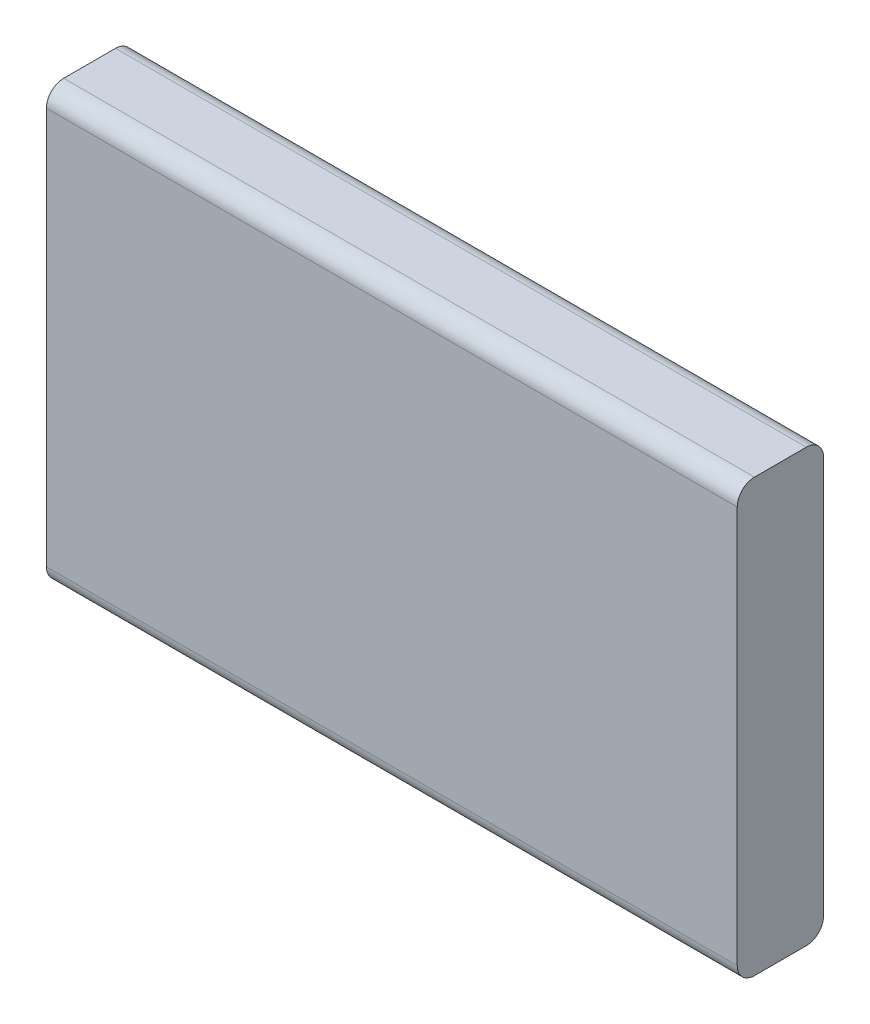
ISO-10303-21;
HEADER;
FILE_DESCRIPTION(('STEP AP214'),'2;1');
FILE_NAME('part.step','',(''),(''),'','','');
FILE_SCHEMA(('AUTOMOTIVE_DESIGN { 1 0 10303 214 1 1 1 1 }'));
ENDSEC;
DATA;
#1=APPLICATION_CONTEXT('core data for automotive mechanical design processes');
#2=APPLICATION_PROTOCOL_DEFINITION('international standard','automotive_design',2000,#1);
#3=PRODUCT_CONTEXT('',#1,'mechanical');
#4=PRODUCT('Part','Part','',(#3));
#5=PRODUCT_RELATED_PRODUCT_CATEGORY('part','',(#4));
#6=PRODUCT_DEFINITION_FORMATION('','',#4);
#7=PRODUCT_DEFINITION_CONTEXT('part definition',#1,'design');
#8=PRODUCT_DEFINITION('design','',#6,#7);
#9=PRODUCT_DEFINITION_SHAPE('','',#8);
#10=(LENGTH_UNIT() NAMED_UNIT(*) SI_UNIT(.MILLI.,.METRE.));
#11=(NAMED_UNIT(*) PLANE_ANGLE_UNIT() SI_UNIT($,.RADIAN.));
#12=(NAMED_UNIT(*) SI_UNIT($,.STERADIAN.) SOLID_ANGLE_UNIT());
#13=UNCERTAINTY_MEASURE_WITH_UNIT(LENGTH_MEASURE(1.E-05),#10,'distance_accuracy_value','');
#14=(GEOMETRIC_REPRESENTATION_CONTEXT(3) GLOBAL_UNCERTAINTY_ASSIGNED_CONTEXT((#13)) GLOBAL_UNIT_ASSIGNED_CONTEXT((#10,
#11,#12)) REPRESENTATION_CONTEXT('',''));
#15=CARTESIAN_POINT('',(0.,0.,0.));
#16=DIRECTION('',(0.,0.,1.));
#17=DIRECTION('',(1.,0.,0.));
#18=AXIS2_PLACEMENT_3D('',#15,#16,#17);
#19=CARTESIAN_POINT('',(-20.,12.5,-5.));
#20=DIRECTION('',(-1.,0.,0.));
#21=DIRECTION('',(0.,0.,1.));
#22=AXIS2_PLACEMENT_3D('',#19,#20,#21);
#23=PLANE('',#22);
#24=DIRECTION('',(0.,0.,1.));
#25=VECTOR('',#24,1.);
#26=CARTESIAN_POINT('',(-20.,12.5,-5.));
#27=LINE('',#26,#25);
#28=CARTESIAN_POINT('',(-20.,12.5,-4.));
#29=VERTEX_POINT('',#28);
#30=CARTESIAN_POINT('',(-20.,12.5,-1.));
#31=VERTEX_POINT('',#30);
#32=EDGE_CURVE('E119',#29,#31,#27,.T.);
#33=ORIENTED_EDGE('',*,*,#32,.F.);
#34=CARTESIAN_POINT('',(-20.,11.5,-4.));
#35=DIRECTION('',(-1.,0.,0.));
#36=DIRECTION('',(0.,0.,1.));
#37=AXIS2_PLACEMENT_3D('',#34,#35,#36);
#38=CIRCLE('',#37,1.);
#39=CARTESIAN_POINT('',(-20.,11.5,-5.));
#40=VERTEX_POINT('',#39);
#41=EDGE_CURVE('E147',#29,#40,#38,.T.);
#42=ORIENTED_EDGE('',*,*,#41,.T.);
#43=DIRECTION('',(0.,-1.,0.));
#44=VECTOR('',#43,1.);
#45=CARTESIAN_POINT('',(-20.,12.5,-5.));
#46=LINE('',#45,#44);
#47=CARTESIAN_POINT('',(-20.,-11.5,-5.));
#48=VERTEX_POINT('',#47);
#49=EDGE_CURVE('E125',#40,#48,#46,.T.);
#50=ORIENTED_EDGE('',*,*,#49,.T.);
#51=CARTESIAN_POINT('',(-20.,-11.5,-4.));
#52=DIRECTION('',(-1.,0.,0.));
#53=DIRECTION('',(0.,0.,1.));
#54=AXIS2_PLACEMENT_3D('',#51,#52,#53);
#55=CIRCLE('',#54,1.);
#56=CARTESIAN_POINT('',(-20.,-12.5,-4.));
#57=VERTEX_POINT('',#56);
#58=EDGE_CURVE('E144',#48,#57,#55,.T.);
#59=ORIENTED_EDGE('',*,*,#58,.T.);
#60=DIRECTION('',(0.,0.,1.));
#61=VECTOR('',#60,1.);
#62=CARTESIAN_POINT('',(-20.,-12.5,-5.));
#63=LINE('',#62,#61);
#64=CARTESIAN_POINT('',(-20.,-12.5,-1.));
#65=VERTEX_POINT('',#64);
#66=EDGE_CURVE('E136',#57,#65,#63,.T.);
#67=ORIENTED_EDGE('',*,*,#66,.T.);
#68=CARTESIAN_POINT('',(-20.,-11.5,-1.));
#69=DIRECTION('',(-1.,0.,0.));
#70=DIRECTION('',(0.,0.,1.));
#71=AXIS2_PLACEMENT_3D('',#68,#69,#70);
#72=CIRCLE('',#71,1.);
#73=CARTESIAN_POINT('',(-20.,-11.5,0.));
#74=VERTEX_POINT('',#73);
#75=EDGE_CURVE('E123',#65,#74,#72,.T.);
#76=ORIENTED_EDGE('',*,*,#75,.T.);
#77=DIRECTION('',(0.,-1.,0.));
#78=VECTOR('',#77,1.);
#79=CARTESIAN_POINT('',(-20.,12.5,0.));
#80=LINE('',#79,#78);
#81=CARTESIAN_POINT('',(-20.,11.5,0.));
#82=VERTEX_POINT('',#81);
#83=EDGE_CURVE('E115',#82,#74,#80,.T.);
#84=ORIENTED_EDGE('',*,*,#83,.F.);
#85=CARTESIAN_POINT('',(-20.,11.5,-1.));
#86=DIRECTION('',(-1.,0.,0.));
#87=DIRECTION('',(0.,0.,1.));
#88=AXIS2_PLACEMENT_3D('',#85,#86,#87);
#89=CIRCLE('',#88,1.);
#90=EDGE_CURVE('E100',#82,#31,#89,.T.);
#91=ORIENTED_EDGE('',*,*,#90,.T.);
#92=EDGE_LOOP('',(#33,#42,#50,#59,#67,#76,#84,#91));
#93=FACE_BOUND('',#92,.T.);
#94=ADVANCED_FACE('F33',(#93),#23,.T.);
#95=CARTESIAN_POINT('',(-20.,12.5,-5.));
#96=DIRECTION('',(0.,1.,0.));
#97=DIRECTION('',(-1.,0.,0.));
#98=AXIS2_PLACEMENT_3D('',#95,#96,#97);
#99=PLANE('',#98);
#100=DIRECTION('',(0.,0.,1.));
#101=VECTOR('',#100,1.);
#102=CARTESIAN_POINT('',(20.,12.5,-5.));
#103=LINE('',#102,#101);
#104=CARTESIAN_POINT('',(20.,12.5,-4.));
#105=VERTEX_POINT('',#104);
#106=CARTESIAN_POINT('',(20.,12.5,-1.));
#107=VERTEX_POINT('',#106);
#108=EDGE_CURVE('E132',#105,#107,#103,.T.);
#109=ORIENTED_EDGE('',*,*,#108,.F.);
#110=DIRECTION('',(-1.,0.,0.));
#111=VECTOR('',#110,1.);
#112=CARTESIAN_POINT('',(-20.,12.5,-4.));
#113=LINE('',#112,#111);
#114=EDGE_CURVE('E141',#105,#29,#113,.T.);
#115=ORIENTED_EDGE('',*,*,#114,.T.);
#116=ORIENTED_EDGE('',*,*,#32,.T.);
#117=DIRECTION('',(-1.,0.,0.));
#118=VECTOR('',#117,1.);
#119=CARTESIAN_POINT('',(-20.,12.5,-1.));
#120=LINE('',#119,#118);
#121=EDGE_CURVE('E106',#31,#107,#120,.F.);
#122=ORIENTED_EDGE('',*,*,#121,.T.);
#123=EDGE_LOOP('',(#109,#115,#116,#122));
#124=FACE_BOUND('',#123,.T.);
#125=ADVANCED_FACE('F177',(#124),#99,.T.);
#126=CARTESIAN_POINT('',(20.,12.5,-5.));
#127=DIRECTION('',(1.,0.,0.));
#128=DIRECTION('',(0.,0.,-1.));
#129=AXIS2_PLACEMENT_3D('',#126,#127,#128);
#130=PLANE('',#129);
#131=DIRECTION('',(0.,1.,0.));
#132=VECTOR('',#131,1.);
#133=CARTESIAN_POINT('',(20.,12.5,-5.));
#134=LINE('',#133,#132);
#135=CARTESIAN_POINT('',(20.,-11.5,-5.));
#136=VERTEX_POINT('',#135);
#137=CARTESIAN_POINT('',(20.,11.5,-5.));
#138=VERTEX_POINT('',#137);
#139=EDGE_CURVE('E128',#136,#138,#134,.T.);
#140=ORIENTED_EDGE('',*,*,#139,.T.);
#141=CARTESIAN_POINT('',(20.,11.5,-4.));
#142=DIRECTION('',(1.,0.,0.));
#143=DIRECTION('',(0.,0.,-1.));
#144=AXIS2_PLACEMENT_3D('',#141,#142,#143);
#145=CIRCLE('',#144,1.);
#146=EDGE_CURVE('E155',#138,#105,#145,.T.);
#147=ORIENTED_EDGE('',*,*,#146,.T.);
#148=ORIENTED_EDGE('',*,*,#108,.T.);
#149=CARTESIAN_POINT('',(20.,11.5,-1.));
#150=DIRECTION('',(1.,0.,0.));
#151=DIRECTION('',(0.,0.,-1.));
#152=AXIS2_PLACEMENT_3D('',#149,#150,#151);
#153=CIRCLE('',#152,1.);
#154=CARTESIAN_POINT('',(20.,11.5,0.));
#155=VERTEX_POINT('',#154);
#156=EDGE_CURVE('E139',#107,#155,#153,.T.);
#157=ORIENTED_EDGE('',*,*,#156,.T.);
#158=DIRECTION('',(0.,1.,0.));
#159=VECTOR('',#158,1.);
#160=CARTESIAN_POINT('',(20.,12.5,0.));
#161=LINE('',#160,#159);
#162=CARTESIAN_POINT('',(20.,-11.5,0.));
#163=VERTEX_POINT('',#162);
#164=EDGE_CURVE('E117',#163,#155,#161,.T.);
#165=ORIENTED_EDGE('',*,*,#164,.F.);
#166=CARTESIAN_POINT('',(20.,-11.5,-1.));
#167=DIRECTION('',(1.,0.,0.));
#168=DIRECTION('',(0.,0.,-1.));
#169=AXIS2_PLACEMENT_3D('',#166,#167,#168);
#170=CIRCLE('',#169,1.);
#171=CARTESIAN_POINT('',(20.,-12.5,-1.));
#172=VERTEX_POINT('',#171);
#173=EDGE_CURVE('E48',#163,#172,#170,.T.);
#174=ORIENTED_EDGE('',*,*,#173,.T.);
#175=DIRECTION('',(0.,0.,1.));
#176=VECTOR('',#175,1.);
#177=CARTESIAN_POINT('',(20.,-12.5,-5.));
#178=LINE('',#177,#176);
#179=CARTESIAN_POINT('',(20.,-12.5,-4.));
#180=VERTEX_POINT('',#179);
#181=EDGE_CURVE('E134',#180,#172,#178,.T.);
#182=ORIENTED_EDGE('',*,*,#181,.F.);
#183=CARTESIAN_POINT('',(20.,-11.5,-4.));
#184=DIRECTION('',(1.,0.,0.));
#185=DIRECTION('',(0.,0.,-1.));
#186=AXIS2_PLACEMENT_3D('',#183,#184,#185);
#187=CIRCLE('',#186,1.);
#188=EDGE_CURVE('E56',#180,#136,#187,.T.);
#189=ORIENTED_EDGE('',*,*,#188,.T.);
#190=EDGE_LOOP('',(#140,#147,#148,#157,#165,#174,#182,#189));
#191=FACE_BOUND('',#190,.T.);
#192=ADVANCED_FACE('F164',(#191),#130,.T.);
#193=CARTESIAN_POINT('',(-20.,-12.5,-5.));
#194=DIRECTION('',(0.,-1.,0.));
#195=DIRECTION('',(1.,0.,0.));
#196=AXIS2_PLACEMENT_3D('',#193,#194,#195);
#197=PLANE('',#196);
#198=ORIENTED_EDGE('',*,*,#181,.T.);
#199=DIRECTION('',(1.,0.,0.));
#200=VECTOR('',#199,1.);
#201=CARTESIAN_POINT('',(-20.,-12.5,-1.));
#202=LINE('',#201,#200);
#203=EDGE_CURVE('E11',#172,#65,#202,.F.);
#204=ORIENTED_EDGE('',*,*,#203,.T.);
#205=ORIENTED_EDGE('',*,*,#66,.F.);
#206=DIRECTION('',(1.,0.,0.));
#207=VECTOR('',#206,1.);
#208=CARTESIAN_POINT('',(20.,-12.5,-4.));
#209=LINE('',#208,#207);
#210=EDGE_CURVE('E41',#57,#180,#209,.T.);
#211=ORIENTED_EDGE('',*,*,#210,.T.);
#212=EDGE_LOOP('',(#198,#204,#205,#211));
#213=FACE_BOUND('',#212,.T.);
#214=ADVANCED_FACE('F160',(#213),#197,.T.);
#215=CARTESIAN_POINT('',(0.,0.,-5.));
#216=DIRECTION('',(0.,0.,1.));
#217=DIRECTION('',(1.,0.,0.));
#218=AXIS2_PLACEMENT_3D('',#215,#216,#217);
#219=PLANE('',#218);
#220=ORIENTED_EDGE('',*,*,#49,.F.);
#221=DIRECTION('',(-1.,0.,0.));
#222=VECTOR('',#221,1.);
#223=CARTESIAN_POINT('',(20.,11.5,-5.));
#224=LINE('',#223,#222);
#225=EDGE_CURVE('E151',#40,#138,#224,.F.);
#226=ORIENTED_EDGE('',*,*,#225,.T.);
#227=ORIENTED_EDGE('',*,*,#139,.F.);
#228=DIRECTION('',(1.,0.,0.));
#229=VECTOR('',#228,1.);
#230=CARTESIAN_POINT('',(-20.,-11.5,-5.));
#231=LINE('',#230,#229);
#232=EDGE_CURVE('E149',#136,#48,#231,.F.);
#233=ORIENTED_EDGE('',*,*,#232,.T.);
#234=EDGE_LOOP('',(#220,#226,#227,#233));
#235=FACE_BOUND('',#234,.T.);
#236=ADVANCED_FACE('F169',(#235),#219,.F.);
#237=CARTESIAN_POINT('',(0.,0.,0.));
#238=DIRECTION('',(0.,0.,1.));
#239=DIRECTION('',(1.,0.,0.));
#240=AXIS2_PLACEMENT_3D('',#237,#238,#239);
#241=PLANE('',#240);
#242=ORIENTED_EDGE('',*,*,#83,.T.);
#243=DIRECTION('',(1.,0.,0.));
#244=VECTOR('',#243,1.);
#245=CARTESIAN_POINT('',(0.,-11.5,0.));
#246=LINE('',#245,#244);
#247=EDGE_CURVE('E157',#74,#163,#246,.T.);
#248=ORIENTED_EDGE('',*,*,#247,.T.);
#249=ORIENTED_EDGE('',*,*,#164,.T.);
#250=DIRECTION('',(-1.,0.,0.));
#251=VECTOR('',#250,1.);
#252=CARTESIAN_POINT('',(0.,11.5,0.));
#253=LINE('',#252,#251);
#254=EDGE_CURVE('E104',#155,#82,#253,.T.);
#255=ORIENTED_EDGE('',*,*,#254,.T.);
#256=EDGE_LOOP('',(#242,#248,#249,#255));
#257=FACE_BOUND('',#256,.T.);
#258=ADVANCED_FACE('F113',(#257),#241,.T.);
#259=CARTESIAN_POINT('',(0.,11.5,-1.));
#260=DIRECTION('',(-1.,0.,0.));
#261=DIRECTION('',(0.,-1.,0.));
#262=AXIS2_PLACEMENT_3D('',#259,#260,#261);
#263=CYLINDRICAL_SURFACE('',#262,1.);
#264=ORIENTED_EDGE('',*,*,#156,.F.);
#265=ORIENTED_EDGE('',*,*,#121,.F.);
#266=ORIENTED_EDGE('',*,*,#90,.F.);
#267=ORIENTED_EDGE('',*,*,#254,.F.);
#268=EDGE_LOOP('',(#264,#265,#266,#267));
#269=FACE_BOUND('',#268,.T.);
#270=ADVANCED_FACE('F103',(#269),#263,.T.);
#271=CARTESIAN_POINT('',(-20.,11.5,-4.));
#272=DIRECTION('',(1.,0.,0.));
#273=DIRECTION('',(0.,1.,0.));
#274=AXIS2_PLACEMENT_3D('',#271,#272,#273);
#275=CYLINDRICAL_SURFACE('',#274,1.);
#276=ORIENTED_EDGE('',*,*,#146,.F.);
#277=ORIENTED_EDGE('',*,*,#225,.F.);
#278=ORIENTED_EDGE('',*,*,#41,.F.);
#279=ORIENTED_EDGE('',*,*,#114,.F.);
#280=EDGE_LOOP('',(#276,#277,#278,#279));
#281=FACE_BOUND('',#280,.T.);
#282=ADVANCED_FACE('F173',(#281),#275,.T.);
#283=CARTESIAN_POINT('',(0.,-11.5,-1.));
#284=DIRECTION('',(1.,0.,0.));
#285=DIRECTION('',(0.,1.,0.));
#286=AXIS2_PLACEMENT_3D('',#283,#284,#285);
#287=CYLINDRICAL_SURFACE('',#286,1.);
#288=ORIENTED_EDGE('',*,*,#75,.F.);
#289=ORIENTED_EDGE('',*,*,#203,.F.);
#290=ORIENTED_EDGE('',*,*,#173,.F.);
#291=ORIENTED_EDGE('',*,*,#247,.F.);
#292=EDGE_LOOP('',(#288,#289,#290,#291));
#293=FACE_BOUND('',#292,.T.);
#294=ADVANCED_FACE('F194',(#293),#287,.T.);
#295=CARTESIAN_POINT('',(-20.,-11.5,-4.));
#296=DIRECTION('',(-1.,0.,0.));
#297=DIRECTION('',(0.,-1.,0.));
#298=AXIS2_PLACEMENT_3D('',#295,#296,#297);
#299=CYLINDRICAL_SURFACE('',#298,1.);
#300=ORIENTED_EDGE('',*,*,#58,.F.);
#301=ORIENTED_EDGE('',*,*,#232,.F.);
#302=ORIENTED_EDGE('',*,*,#188,.F.);
#303=ORIENTED_EDGE('',*,*,#210,.F.);
#304=EDGE_LOOP('',(#300,#301,#302,#303));
#305=FACE_BOUND('',#304,.T.);
#306=ADVANCED_FACE('F35',(#305),#299,.T.);
#307=CLOSED_SHELL('',(#94,#125,#192,#214,#236,#258,#270,#282,#294,#306));
#308=MANIFOLD_SOLID_BREP('B2',#307);
#309=ADVANCED_BREP_SHAPE_REPRESENTATION('',(#18,#308),#14);
#310=SHAPE_DEFINITION_REPRESENTATION(#9,#309);
ENDSEC;
END-ISO-10303-21;
